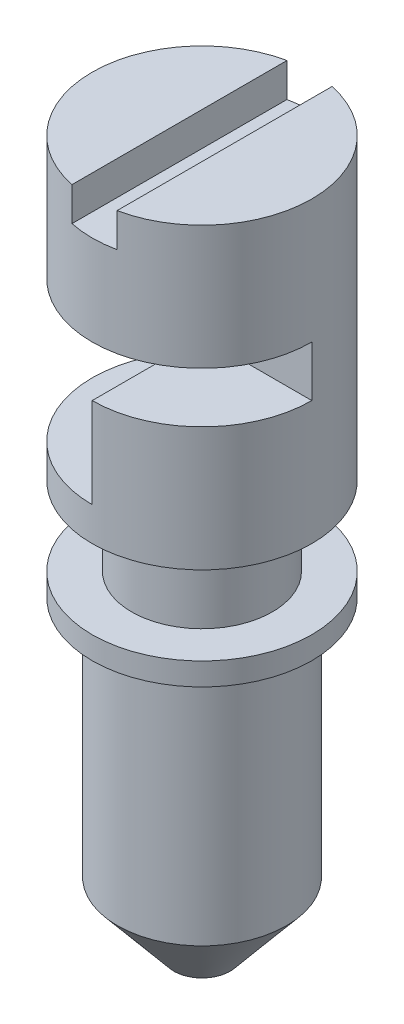
ISO-10303-21;
HEADER;
FILE_DESCRIPTION(('STEP AP214'),'2;1');
FILE_NAME('part.step','',(''),(''),'','','');
FILE_SCHEMA(('AUTOMOTIVE_DESIGN { 1 0 10303 214 1 1 1 1 }'));
ENDSEC;
DATA;
#1=APPLICATION_CONTEXT('core data for automotive mechanical design processes');
#2=APPLICATION_PROTOCOL_DEFINITION('international standard','automotive_design',2000,#1);
#3=PRODUCT_CONTEXT('',#1,'mechanical');
#4=PRODUCT('Part','Part','',(#3));
#5=PRODUCT_RELATED_PRODUCT_CATEGORY('part','',(#4));
#6=PRODUCT_DEFINITION_FORMATION('','',#4);
#7=PRODUCT_DEFINITION_CONTEXT('part definition',#1,'design');
#8=PRODUCT_DEFINITION('design','',#6,#7);
#9=PRODUCT_DEFINITION_SHAPE('','',#8);
#10=(LENGTH_UNIT() NAMED_UNIT(*) SI_UNIT(.MILLI.,.METRE.));
#11=(NAMED_UNIT(*) PLANE_ANGLE_UNIT() SI_UNIT($,.RADIAN.));
#12=(NAMED_UNIT(*) SI_UNIT($,.STERADIAN.) SOLID_ANGLE_UNIT());
#13=UNCERTAINTY_MEASURE_WITH_UNIT(LENGTH_MEASURE(1.E-05),#10,'distance_accuracy_value','');
#14=(GEOMETRIC_REPRESENTATION_CONTEXT(3) GLOBAL_UNCERTAINTY_ASSIGNED_CONTEXT((#13)) GLOBAL_UNIT_ASSIGNED_CONTEXT((#10,
#11,#12)) REPRESENTATION_CONTEXT('',''));
#15=CARTESIAN_POINT('',(0.,0.,0.));
#16=DIRECTION('',(0.,0.,1.));
#17=DIRECTION('',(1.,0.,0.));
#18=AXIS2_PLACEMENT_3D('',#15,#16,#17);
#19=CARTESIAN_POINT('',(0.,5.3,0.));
#20=DIRECTION('',(0.,1.,0.));
#21=DIRECTION('',(0.,0.,1.));
#22=AXIS2_PLACEMENT_3D('',#19,#20,#21);
#23=PLANE('',#22);
#24=DIRECTION('',(0.,0.,-1.));
#25=VECTOR('',#24,1.);
#26=CARTESIAN_POINT('',(0.4,5.3,0.));
#27=LINE('',#26,#25);
#28=CARTESIAN_POINT('',(0.4,5.3,1.90853346839923));
#29=VERTEX_POINT('',#28);
#30=CARTESIAN_POINT('',(0.4,5.3,-1.90853346839923));
#31=VERTEX_POINT('',#30);
#32=EDGE_CURVE('E163',#29,#31,#27,.T.);
#33=ORIENTED_EDGE('',*,*,#32,.F.);
#34=CARTESIAN_POINT('',(0.,5.3,0.));
#35=DIRECTION('',(0.,1.,0.));
#36=DIRECTION('',(0.,0.,1.));
#37=AXIS2_PLACEMENT_3D('',#34,#35,#36);
#38=CIRCLE('',#37,1.95);
#39=EDGE_CURVE('E158',#29,#31,#38,.T.);
#40=ORIENTED_EDGE('',*,*,#39,.T.);
#41=EDGE_LOOP('',(#33,#40));
#42=FACE_BOUND('',#41,.T.);
#43=ADVANCED_FACE('F38',(#42),#23,.T.);
#44=CARTESIAN_POINT('',(0.,5.3,0.));
#45=DIRECTION('',(0.,-1.,0.));
#46=DIRECTION('',(0.,0.,-1.));
#47=AXIS2_PLACEMENT_3D('',#44,#45,#46);
#48=CYLINDRICAL_SURFACE('',#47,1.95);
#49=CARTESIAN_POINT('',(0.,3.1,0.));
#50=DIRECTION('',(0.,1.,0.));
#51=DIRECTION('',(0.,0.,1.));
#52=AXIS2_PLACEMENT_3D('',#49,#50,#51);
#53=CIRCLE('',#52,1.95);
#54=CARTESIAN_POINT('',(0.,3.1,-1.95));
#55=VERTEX_POINT('',#54);
#56=CARTESIAN_POINT('',(1.95,3.1,0.));
#57=VERTEX_POINT('',#56);
#58=EDGE_CURVE('E119',#55,#57,#53,.T.);
#59=ORIENTED_EDGE('',*,*,#58,.T.);
#60=DIRECTION('',(0.,1.,0.));
#61=VECTOR('',#60,1.);
#62=CARTESIAN_POINT('',(1.95,2.2,0.));
#63=LINE('',#62,#61);
#64=CARTESIAN_POINT('',(1.95,2.2,0.));
#65=VERTEX_POINT('',#64);
#66=EDGE_CURVE('E115',#65,#57,#63,.T.);
#67=ORIENTED_EDGE('',*,*,#66,.F.);
#68=CARTESIAN_POINT('',(0.,2.2,0.));
#69=DIRECTION('',(0.,-1.,0.));
#70=DIRECTION('',(0.,0.,-1.));
#71=AXIS2_PLACEMENT_3D('',#68,#69,#70);
#72=CIRCLE('',#71,1.95);
#73=CARTESIAN_POINT('',(0.,2.2,1.95));
#74=VERTEX_POINT('',#73);
#75=EDGE_CURVE('E103',#65,#74,#72,.T.);
#76=ORIENTED_EDGE('',*,*,#75,.T.);
#77=DIRECTION('',(0.,1.,0.));
#78=VECTOR('',#77,1.);
#79=CARTESIAN_POINT('',(0.,0.6,1.95));
#80=LINE('',#79,#78);
#81=CARTESIAN_POINT('',(0.,0.6,1.95));
#82=VERTEX_POINT('',#81);
#83=EDGE_CURVE('E109',#82,#74,#80,.T.);
#84=ORIENTED_EDGE('',*,*,#83,.F.);
#85=CARTESIAN_POINT('',(0.,0.600000000000001,0.));
#86=DIRECTION('',(0.,-1.,0.));
#87=DIRECTION('',(1.,0.,0.));
#88=AXIS2_PLACEMENT_3D('',#85,#86,#87);
#89=CIRCLE('',#88,1.95);
#90=CARTESIAN_POINT('',(0.,0.6,-1.95));
#91=VERTEX_POINT('',#90);
#92=EDGE_CURVE('E168',#82,#91,#89,.T.);
#93=ORIENTED_EDGE('',*,*,#92,.T.);
#94=DIRECTION('',(0.,1.,0.));
#95=VECTOR('',#94,1.);
#96=CARTESIAN_POINT('',(0.,0.6,-1.95));
#97=LINE('',#96,#95);
#98=EDGE_CURVE('E130',#91,#55,#97,.T.);
#99=ORIENTED_EDGE('',*,*,#98,.T.);
#100=EDGE_LOOP('',(#59,#67,#76,#84,#93,#99));
#101=FACE_BOUND('',#100,.T.);
#102=CARTESIAN_POINT('',(0.,4.7,0.));
#103=DIRECTION('',(0.,1.,0.));
#104=DIRECTION('',(0.,0.,1.));
#105=AXIS2_PLACEMENT_3D('',#102,#103,#104);
#106=CIRCLE('',#105,1.95);
#107=CARTESIAN_POINT('',(0.4,4.7,-1.90853346839923));
#108=VERTEX_POINT('',#107);
#109=CARTESIAN_POINT('',(-0.4,4.7,-1.90853346839923));
#110=VERTEX_POINT('',#109);
#111=EDGE_CURVE('E167',#108,#110,#106,.T.);
#112=ORIENTED_EDGE('',*,*,#111,.F.);
#113=DIRECTION('',(0.,-1.,0.));
#114=VECTOR('',#113,1.);
#115=CARTESIAN_POINT('',(0.4,5.3,-1.90853346839923));
#116=LINE('',#115,#114);
#117=EDGE_CURVE('E148',#108,#31,#116,.F.);
#118=ORIENTED_EDGE('',*,*,#117,.T.);
#119=ORIENTED_EDGE('',*,*,#39,.F.);
#120=DIRECTION('',(0.,-1.,0.));
#121=VECTOR('',#120,1.);
#122=CARTESIAN_POINT('',(0.4,5.3,1.90853346839923));
#123=LINE('',#122,#121);
#124=CARTESIAN_POINT('',(0.4,4.7,1.90853346839923));
#125=VERTEX_POINT('',#124);
#126=EDGE_CURVE('E151',#29,#125,#123,.T.);
#127=ORIENTED_EDGE('',*,*,#126,.T.);
#128=CARTESIAN_POINT('',(-0.4,4.7,1.90853346839923));
#129=VERTEX_POINT('',#128);
#130=EDGE_CURVE('E165',#129,#125,#106,.T.);
#131=ORIENTED_EDGE('',*,*,#130,.F.);
#132=DIRECTION('',(0.,-1.,0.));
#133=VECTOR('',#132,1.);
#134=CARTESIAN_POINT('',(-0.4,5.3,1.90853346839923));
#135=LINE('',#134,#133);
#136=CARTESIAN_POINT('',(-0.4,5.3,1.90853346839923));
#137=VERTEX_POINT('',#136);
#138=EDGE_CURVE('E142',#129,#137,#135,.F.);
#139=ORIENTED_EDGE('',*,*,#138,.T.);
#140=CARTESIAN_POINT('',(-0.4,5.3,-1.90853346839923));
#141=VERTEX_POINT('',#140);
#142=EDGE_CURVE('E155',#141,#137,#38,.T.);
#143=ORIENTED_EDGE('',*,*,#142,.F.);
#144=DIRECTION('',(0.,-1.,0.));
#145=VECTOR('',#144,1.);
#146=CARTESIAN_POINT('',(-0.4,5.3,-1.90853346839923));
#147=LINE('',#146,#145);
#148=EDGE_CURVE('E145',#141,#110,#147,.T.);
#149=ORIENTED_EDGE('',*,*,#148,.T.);
#150=EDGE_LOOP('',(#112,#118,#119,#127,#131,#139,#143,#149));
#151=FACE_BOUND('',#150,.T.);
#152=CARTESIAN_POINT('',(0.,0.,0.));
#153=DIRECTION('',(0.,1.,0.));
#154=DIRECTION('',(0.,0.,1.));
#155=AXIS2_PLACEMENT_3D('',#152,#153,#154);
#156=CIRCLE('',#155,1.95);
#157=CARTESIAN_POINT('',(0.,0.,1.95));
#158=VERTEX_POINT('',#157);
#159=EDGE_CURVE('E154',#158,#158,#156,.T.);
#160=ORIENTED_EDGE('',*,*,#159,.T.);
#161=EDGE_LOOP('',(#160));
#162=FACE_BOUND('',#161,.T.);
#163=ADVANCED_FACE('F40',(#101,#151,#162),#48,.T.);
#164=DIRECTION('',(0.,0.,1.));
#165=VECTOR('',#164,1.);
#166=CARTESIAN_POINT('',(-0.4,5.3,0.));
#167=LINE('',#166,#165);
#168=EDGE_CURVE('E161',#141,#137,#167,.T.);
#169=ORIENTED_EDGE('',*,*,#168,.F.);
#170=ORIENTED_EDGE('',*,*,#142,.T.);
#171=EDGE_LOOP('',(#169,#170));
#172=FACE_BOUND('',#171,.T.);
#173=ADVANCED_FACE('F192',(#172),#23,.T.);
#174=CARTESIAN_POINT('',(0.,0.,0.));
#175=DIRECTION('',(0.,1.,0.));
#176=DIRECTION('',(0.,0.,1.));
#177=AXIS2_PLACEMENT_3D('',#174,#175,#176);
#178=PLANE('',#177);
#179=CARTESIAN_POINT('',(0.,0.,0.));
#180=DIRECTION('',(0.,1.,0.));
#181=DIRECTION('',(-1.,0.,0.));
#182=AXIS2_PLACEMENT_3D('',#179,#180,#181);
#183=CIRCLE('',#182,1.25);
#184=CARTESIAN_POINT('',(-1.25,0.,0.));
#185=VERTEX_POINT('',#184);
#186=EDGE_CURVE('E121',#185,#185,#183,.T.);
#187=ORIENTED_EDGE('',*,*,#186,.T.);
#188=EDGE_LOOP('',(#187));
#189=FACE_BOUND('',#188,.T.);
#190=ORIENTED_EDGE('',*,*,#159,.F.);
#191=EDGE_LOOP('',(#190));
#192=FACE_BOUND('',#191,.T.);
#193=ADVANCED_FACE('F199',(#189,#192),#178,.F.);
#194=CARTESIAN_POINT('',(0.,4.7,0.));
#195=DIRECTION('',(0.,1.,0.));
#196=DIRECTION('',(0.,0.,1.));
#197=AXIS2_PLACEMENT_3D('',#194,#195,#196);
#198=PLANE('',#197);
#199=DIRECTION('',(0.,0.,-1.));
#200=VECTOR('',#199,1.);
#201=CARTESIAN_POINT('',(0.4,4.7,-1.95));
#202=LINE('',#201,#200);
#203=EDGE_CURVE('E135',#125,#108,#202,.T.);
#204=ORIENTED_EDGE('',*,*,#203,.T.);
#205=ORIENTED_EDGE('',*,*,#111,.T.);
#206=DIRECTION('',(0.,0.,1.));
#207=VECTOR('',#206,1.);
#208=CARTESIAN_POINT('',(-0.4,4.7,-1.95));
#209=LINE('',#208,#207);
#210=EDGE_CURVE('E139',#110,#129,#209,.T.);
#211=ORIENTED_EDGE('',*,*,#210,.T.);
#212=ORIENTED_EDGE('',*,*,#130,.T.);
#213=EDGE_LOOP('',(#204,#205,#211,#212));
#214=FACE_BOUND('',#213,.T.);
#215=ADVANCED_FACE('F204',(#214),#198,.T.);
#216=CARTESIAN_POINT('',(0.4,4.7,-1.95));
#217=DIRECTION('',(1.,0.,0.));
#218=DIRECTION('',(0.,0.,-1.));
#219=AXIS2_PLACEMENT_3D('',#216,#217,#218);
#220=PLANE('',#219);
#221=ORIENTED_EDGE('',*,*,#32,.T.);
#222=ORIENTED_EDGE('',*,*,#117,.F.);
#223=ORIENTED_EDGE('',*,*,#203,.F.);
#224=ORIENTED_EDGE('',*,*,#126,.F.);
#225=EDGE_LOOP('',(#221,#222,#223,#224));
#226=FACE_BOUND('',#225,.T.);
#227=ADVANCED_FACE('F184',(#226),#220,.F.);
#228=CARTESIAN_POINT('',(-0.4,4.7,-1.95));
#229=DIRECTION('',(-1.,0.,0.));
#230=DIRECTION('',(0.,0.,1.));
#231=AXIS2_PLACEMENT_3D('',#228,#229,#230);
#232=PLANE('',#231);
#233=ORIENTED_EDGE('',*,*,#168,.T.);
#234=ORIENTED_EDGE('',*,*,#138,.F.);
#235=ORIENTED_EDGE('',*,*,#210,.F.);
#236=ORIENTED_EDGE('',*,*,#148,.F.);
#237=EDGE_LOOP('',(#233,#234,#235,#236));
#238=FACE_BOUND('',#237,.T.);
#239=ADVANCED_FACE('F177',(#238),#232,.F.);
#240=CARTESIAN_POINT('',(0.,3.1,-1.95));
#241=DIRECTION('',(0.,1.,0.));
#242=DIRECTION('',(0.,0.,1.));
#243=AXIS2_PLACEMENT_3D('',#240,#241,#242);
#244=PLANE('',#243);
#245=DIRECTION('',(0.,0.,1.));
#246=VECTOR('',#245,1.);
#247=CARTESIAN_POINT('',(0.,3.1,-1.95));
#248=LINE('',#247,#246);
#249=CARTESIAN_POINT('',(0.,3.1,0.));
#250=VERTEX_POINT('',#249);
#251=EDGE_CURVE('E132',#55,#250,#248,.T.);
#252=ORIENTED_EDGE('',*,*,#251,.T.);
#253=DIRECTION('',(1.,0.,0.));
#254=VECTOR('',#253,1.);
#255=CARTESIAN_POINT('',(-1.95,3.1,0.));
#256=LINE('',#255,#254);
#257=EDGE_CURVE('E110',#250,#57,#256,.T.);
#258=ORIENTED_EDGE('',*,*,#257,.T.);
#259=ORIENTED_EDGE('',*,*,#58,.F.);
#260=EDGE_LOOP('',(#252,#258,#259));
#261=FACE_BOUND('',#260,.T.);
#262=ADVANCED_FACE('F175',(#261),#244,.F.);
#263=CARTESIAN_POINT('',(0.,0.6,-1.95));
#264=DIRECTION('',(0.,-1.,0.));
#265=DIRECTION('',(1.,0.,0.));
#266=AXIS2_PLACEMENT_3D('',#263,#264,#265);
#267=PLANE('',#266);
#268=DIRECTION('',(0.,0.,1.));
#269=VECTOR('',#268,1.);
#270=CARTESIAN_POINT('',(0.,0.6,-1.95));
#271=LINE('',#270,#269);
#272=EDGE_CURVE('E61',#91,#82,#271,.T.);
#273=ORIENTED_EDGE('',*,*,#272,.F.);
#274=ORIENTED_EDGE('',*,*,#92,.F.);
#275=EDGE_LOOP('',(#273,#274));
#276=FACE_BOUND('',#275,.T.);
#277=ADVANCED_FACE('F173',(#276),#267,.F.);
#278=CARTESIAN_POINT('',(0.,0.6,-1.95));
#279=DIRECTION('',(1.,0.,0.));
#280=DIRECTION('',(0.,0.,-1.));
#281=AXIS2_PLACEMENT_3D('',#278,#279,#280);
#282=PLANE('',#281);
#283=DIRECTION('',(0.,0.,-1.));
#284=VECTOR('',#283,1.);
#285=CARTESIAN_POINT('',(0.,2.2,-1.95));
#286=LINE('',#285,#284);
#287=CARTESIAN_POINT('',(0.,2.2,0.));
#288=VERTEX_POINT('',#287);
#289=EDGE_CURVE('E46',#74,#288,#286,.T.);
#290=ORIENTED_EDGE('',*,*,#289,.T.);
#291=DIRECTION('',(0.,1.,0.));
#292=VECTOR('',#291,1.);
#293=CARTESIAN_POINT('',(0.,0.6,0.));
#294=LINE('',#293,#292);
#295=EDGE_CURVE('E12',#288,#250,#294,.T.);
#296=ORIENTED_EDGE('',*,*,#295,.T.);
#297=ORIENTED_EDGE('',*,*,#251,.F.);
#298=ORIENTED_EDGE('',*,*,#98,.F.);
#299=ORIENTED_EDGE('',*,*,#272,.T.);
#300=ORIENTED_EDGE('',*,*,#83,.T.);
#301=EDGE_LOOP('',(#290,#296,#297,#298,#299,#300));
#302=FACE_BOUND('',#301,.T.);
#303=ADVANCED_FACE('F170',(#302),#282,.F.);
#304=CARTESIAN_POINT('',(-1.95,2.2,0.));
#305=DIRECTION('',(0.,0.,-1.));
#306=DIRECTION('',(-1.,0.,0.));
#307=AXIS2_PLACEMENT_3D('',#304,#305,#306);
#308=PLANE('',#307);
#309=DIRECTION('',(1.,0.,0.));
#310=VECTOR('',#309,1.);
#311=CARTESIAN_POINT('',(-1.95,2.2,0.));
#312=LINE('',#311,#310);
#313=EDGE_CURVE('E53',#288,#65,#312,.T.);
#314=ORIENTED_EDGE('',*,*,#313,.T.);
#315=ORIENTED_EDGE('',*,*,#66,.T.);
#316=ORIENTED_EDGE('',*,*,#257,.F.);
#317=ORIENTED_EDGE('',*,*,#295,.F.);
#318=EDGE_LOOP('',(#314,#315,#316,#317));
#319=FACE_BOUND('',#318,.T.);
#320=ADVANCED_FACE('F114',(#319),#308,.F.);
#321=CARTESIAN_POINT('',(-1.95,2.2,0.));
#322=DIRECTION('',(0.,-1.,0.));
#323=DIRECTION('',(0.,0.,-1.));
#324=AXIS2_PLACEMENT_3D('',#321,#322,#323);
#325=PLANE('',#324);
#326=ORIENTED_EDGE('',*,*,#313,.F.);
#327=ORIENTED_EDGE('',*,*,#289,.F.);
#328=ORIENTED_EDGE('',*,*,#75,.F.);
#329=EDGE_LOOP('',(#326,#327,#328));
#330=FACE_BOUND('',#329,.T.);
#331=ADVANCED_FACE('F104',(#330),#325,.F.);
#332=CARTESIAN_POINT('',(0.,0.,0.));
#333=DIRECTION('',(0.,1.,0.));
#334=DIRECTION('',(-1.,0.,0.));
#335=AXIS2_PLACEMENT_3D('',#332,#333,#334);
#336=CYLINDRICAL_SURFACE('',#335,1.25);
#337=CARTESIAN_POINT('',(0.,-1.4,0.));
#338=DIRECTION('',(0.,1.,0.));
#339=DIRECTION('',(-1.,0.,0.));
#340=AXIS2_PLACEMENT_3D('',#337,#338,#339);
#341=CIRCLE('',#340,1.25);
#342=CARTESIAN_POINT('',(-1.25,-1.4,0.));
#343=VERTEX_POINT('',#342);
#344=EDGE_CURVE('E266',#343,#343,#341,.T.);
#345=ORIENTED_EDGE('',*,*,#344,.T.);
#346=EDGE_LOOP('',(#345));
#347=FACE_BOUND('',#346,.T.);
#348=ORIENTED_EDGE('',*,*,#186,.F.);
#349=EDGE_LOOP('',(#348));
#350=FACE_BOUND('',#349,.T.);
#351=ADVANCED_FACE('F230',(#347,#350),#336,.T.);
#352=CARTESIAN_POINT('',(-0.499999999999999,-7.3,0.));
#353=DIRECTION('',(0.,-1.,0.));
#354=DIRECTION('',(1.,0.,0.));
#355=AXIS2_PLACEMENT_3D('',#352,#353,#354);
#356=PLANE('',#355);
#357=CARTESIAN_POINT('',(0.,-7.3,0.));
#358=DIRECTION('',(0.,1.,0.));
#359=DIRECTION('',(-1.,0.,0.));
#360=AXIS2_PLACEMENT_3D('',#357,#358,#359);
#361=CIRCLE('',#360,0.5);
#362=CARTESIAN_POINT('',(-0.499999999999999,-7.3,0.));
#363=VERTEX_POINT('',#362);
#364=EDGE_CURVE('E124',#363,#363,#361,.T.);
#365=ORIENTED_EDGE('',*,*,#364,.F.);
#366=EDGE_LOOP('',(#365));
#367=FACE_BOUND('',#366,.T.);
#368=ADVANCED_FACE('F234',(#367),#356,.T.);
#369=CARTESIAN_POINT('',(0.,-6.1,0.));
#370=DIRECTION('',(0.,1.,0.));
#371=DIRECTION('',(-1.,0.,0.));
#372=AXIS2_PLACEMENT_3D('',#369,#370,#371);
#373=CONICAL_SURFACE('',#372,1.5,0.694738276196703);
#374=CARTESIAN_POINT('',(0.,-6.1,0.));
#375=DIRECTION('',(0.,1.,0.));
#376=DIRECTION('',(-1.,0.,0.));
#377=AXIS2_PLACEMENT_3D('',#374,#375,#376);
#378=CIRCLE('',#377,1.5);
#379=CARTESIAN_POINT('',(-1.5,-6.1,0.));
#380=VERTEX_POINT('',#379);
#381=EDGE_CURVE('E279',#380,#380,#378,.T.);
#382=CARTESIAN_POINT('',(-0.499999999999999,-7.3,0.));
#383=CARTESIAN_POINT('',(-0.510416666666665,-7.2875,0.));
#384=CARTESIAN_POINT('',(-0.520833333333332,-7.275,0.));
#385=CARTESIAN_POINT('',(-0.541666666666665,-7.25,0.));
#386=CARTESIAN_POINT('',(-0.552083333333332,-7.2375,0.));
#387=CARTESIAN_POINT('',(-0.572916666666665,-7.2125,0.));
#388=CARTESIAN_POINT('',(-0.583333333333332,-7.2,0.));
#389=CARTESIAN_POINT('',(-0.604166666666665,-7.175,0.));
#390=CARTESIAN_POINT('',(-0.614583333333332,-7.1625,0.));
#391=CARTESIAN_POINT('',(-0.635416666666665,-7.1375,0.));
#392=CARTESIAN_POINT('',(-0.645833333333332,-7.125,0.));
#393=CARTESIAN_POINT('',(-0.666666666666665,-7.1,0.));
#394=CARTESIAN_POINT('',(-0.677083333333332,-7.0875,0.));
#395=CARTESIAN_POINT('',(-0.697916666666665,-7.0625,0.));
#396=CARTESIAN_POINT('',(-0.708333333333332,-7.05,0.));
#397=CARTESIAN_POINT('',(-0.729166666666665,-7.025,0.));
#398=CARTESIAN_POINT('',(-0.739583333333332,-7.0125,0.));
#399=CARTESIAN_POINT('',(-0.760416666666665,-6.9875,0.));
#400=CARTESIAN_POINT('',(-0.770833333333332,-6.975,0.));
#401=CARTESIAN_POINT('',(-0.791666666666665,-6.95,0.));
#402=CARTESIAN_POINT('',(-0.802083333333332,-6.9375,0.));
#403=CARTESIAN_POINT('',(-0.822916666666665,-6.9125,0.));
#404=CARTESIAN_POINT('',(-0.833333333333332,-6.9,0.));
#405=CARTESIAN_POINT('',(-0.854166666666665,-6.875,0.));
#406=CARTESIAN_POINT('',(-0.864583333333332,-6.8625,0.));
#407=CARTESIAN_POINT('',(-0.885416666666666,-6.8375,0.));
#408=CARTESIAN_POINT('',(-0.895833333333332,-6.825,0.));
#409=CARTESIAN_POINT('',(-0.916666666666665,-6.8,0.));
#410=CARTESIAN_POINT('',(-0.927083333333332,-6.7875,0.));
#411=CARTESIAN_POINT('',(-0.947916666666665,-6.7625,0.));
#412=CARTESIAN_POINT('',(-0.958333333333332,-6.75,0.));
#413=CARTESIAN_POINT('',(-0.979166666666665,-6.725,0.));
#414=CARTESIAN_POINT('',(-0.989583333333332,-6.7125,0.));
#415=CARTESIAN_POINT('',(-1.01041666666667,-6.6875,0.));
#416=CARTESIAN_POINT('',(-1.02083333333333,-6.675,0.));
#417=CARTESIAN_POINT('',(-1.04166666666667,-6.65,0.));
#418=CARTESIAN_POINT('',(-1.05208333333333,-6.6375,0.));
#419=CARTESIAN_POINT('',(-1.07291666666667,-6.6125,0.));
#420=CARTESIAN_POINT('',(-1.08333333333333,-6.6,0.));
#421=CARTESIAN_POINT('',(-1.10416666666667,-6.575,0.));
#422=CARTESIAN_POINT('',(-1.11458333333333,-6.5625,0.));
#423=CARTESIAN_POINT('',(-1.13541666666667,-6.5375,0.));
#424=CARTESIAN_POINT('',(-1.14583333333333,-6.525,0.));
#425=CARTESIAN_POINT('',(-1.16666666666667,-6.5,0.));
#426=CARTESIAN_POINT('',(-1.17708333333333,-6.4875,0.));
#427=CARTESIAN_POINT('',(-1.19791666666667,-6.4625,0.));
#428=CARTESIAN_POINT('',(-1.20833333333333,-6.45,0.));
#429=CARTESIAN_POINT('',(-1.22916666666667,-6.425,0.));
#430=CARTESIAN_POINT('',(-1.23958333333333,-6.4125,0.));
#431=CARTESIAN_POINT('',(-1.26041666666667,-6.3875,0.));
#432=CARTESIAN_POINT('',(-1.27083333333333,-6.375,0.));
#433=CARTESIAN_POINT('',(-1.29166666666667,-6.35,0.));
#434=CARTESIAN_POINT('',(-1.30208333333333,-6.3375,0.));
#435=CARTESIAN_POINT('',(-1.32291666666667,-6.3125,0.));
#436=CARTESIAN_POINT('',(-1.33333333333333,-6.3,0.));
#437=CARTESIAN_POINT('',(-1.35416666666667,-6.275,0.));
#438=CARTESIAN_POINT('',(-1.36458333333333,-6.2625,0.));
#439=CARTESIAN_POINT('',(-1.38541666666667,-6.2375,0.));
#440=CARTESIAN_POINT('',(-1.39583333333333,-6.225,0.));
#441=CARTESIAN_POINT('',(-1.41666666666667,-6.2,0.));
#442=CARTESIAN_POINT('',(-1.42708333333333,-6.1875,0.));
#443=CARTESIAN_POINT('',(-1.44791666666667,-6.1625,0.));
#444=CARTESIAN_POINT('',(-1.45833333333333,-6.15,0.));
#445=CARTESIAN_POINT('',(-1.47916666666667,-6.125,0.));
#446=CARTESIAN_POINT('',(-1.48958333333333,-6.1125,0.));
#447=CARTESIAN_POINT('',(-1.5,-6.1,0.));
#448=B_SPLINE_CURVE_WITH_KNOTS('',3,(#382,#383,#384,#385,#386,#387,#388,#389,#390,#391,#392,
#393,#394,#395,#396,#397,#398,#399,#400,#401,#402,#403,#404,#405,#406,#407,#408,#409,#410,#411,
#412,#413,#414,#415,#416,#417,#418,#419,#420,#421,#422,#423,#424,#425,#426,#427,#428,#429,#430,
#431,#432,#433,#434,#435,#436,#437,#438,#439,#440,#441,#442,#443,#444,#445,#446,#447),
.UNSPECIFIED.,.F.,.F.,(4,2,2,2,2,2,2,2,2,2,2,2,2,2,2,2,2,2,2,2,2,2,2,2,2,2,2,2,2,2,2,2,4),(0.,
0.048814060474416,0.0976281209488328,0.14644218142325,0.195256241897666,0.244070302372082,
0.292884362846499,0.341698423320916,0.390512483795333,0.439326544269749,0.488140604744165,
0.536954665218582,0.585768725692998,0.634582786167415,0.683396846641832,0.732210907116249,
0.781024967590666,0.829839028065082,0.878653088539498,0.927467149013915,0.976281209488331,
1.02509526996275,1.07390933043716,1.12272339091158,1.171537451386,1.22035151186041,
1.26916557233483,1.31797963280925,1.36679369328366,1.41560775375808,1.4644218142325,
1.51323587470691,1.56204993518133),.UNSPECIFIED.);
#449=EDGE_CURVE('BSEAM238',#363,#380,#448,.T.);
#450=ORIENTED_EDGE('',*,*,#364,.T.);
#451=ORIENTED_EDGE('',*,*,#381,.F.);
#452=ORIENTED_EDGE('',*,*,#449,.T.);
#453=ORIENTED_EDGE('',*,*,#449,.F.);
#454=EDGE_LOOP('',(#450,#452,#451,#453));
#455=FACE_BOUND('',#454,.T.);
#456=ADVANCED_FACE('F238',(#455),#373,.T.);
#457=CARTESIAN_POINT('',(0.,0.,0.));
#458=DIRECTION('',(0.,1.,0.));
#459=DIRECTION('',(-1.,0.,0.));
#460=AXIS2_PLACEMENT_3D('',#457,#458,#459);
#461=CYLINDRICAL_SURFACE('',#460,1.5);
#462=ORIENTED_EDGE('',*,*,#381,.T.);
#463=EDGE_LOOP('',(#462));
#464=FACE_BOUND('',#463,.T.);
#465=CARTESIAN_POINT('',(0.,-1.8,0.));
#466=DIRECTION('',(0.,1.,0.));
#467=DIRECTION('',(-1.,0.,0.));
#468=AXIS2_PLACEMENT_3D('',#465,#466,#467);
#469=CIRCLE('',#468,1.5);
#470=CARTESIAN_POINT('',(-1.5,-1.8,0.));
#471=VERTEX_POINT('',#470);
#472=EDGE_CURVE('E275',#471,#471,#469,.T.);
#473=ORIENTED_EDGE('',*,*,#472,.F.);
#474=EDGE_LOOP('',(#473));
#475=FACE_BOUND('',#474,.T.);
#476=ADVANCED_FACE('F242',(#464,#475),#461,.T.);
#477=CARTESIAN_POINT('',(-1.95,-1.8,0.));
#478=DIRECTION('',(0.,-1.,0.));
#479=DIRECTION('',(1.,0.,0.));
#480=AXIS2_PLACEMENT_3D('',#477,#478,#479);
#481=PLANE('',#480);
#482=ORIENTED_EDGE('',*,*,#472,.T.);
#483=EDGE_LOOP('',(#482));
#484=FACE_BOUND('',#483,.T.);
#485=CARTESIAN_POINT('',(0.,-1.8,0.));
#486=DIRECTION('',(0.,1.,0.));
#487=DIRECTION('',(-1.,0.,0.));
#488=AXIS2_PLACEMENT_3D('',#485,#486,#487);
#489=CIRCLE('',#488,1.95);
#490=CARTESIAN_POINT('',(-1.95,-1.8,0.));
#491=VERTEX_POINT('',#490);
#492=EDGE_CURVE('E269',#491,#491,#489,.T.);
#493=ORIENTED_EDGE('',*,*,#492,.F.);
#494=EDGE_LOOP('',(#493));
#495=FACE_BOUND('',#494,.T.);
#496=ADVANCED_FACE('F246',(#484,#495),#481,.T.);
#497=CARTESIAN_POINT('',(0.,0.,0.));
#498=DIRECTION('',(0.,1.,0.));
#499=DIRECTION('',(-1.,0.,0.));
#500=AXIS2_PLACEMENT_3D('',#497,#498,#499);
#501=CYLINDRICAL_SURFACE('',#500,1.95);
#502=ORIENTED_EDGE('',*,*,#492,.T.);
#503=EDGE_LOOP('',(#502));
#504=FACE_BOUND('',#503,.T.);
#505=CARTESIAN_POINT('',(0.,-1.4,0.));
#506=DIRECTION('',(0.,1.,0.));
#507=DIRECTION('',(-1.,0.,0.));
#508=AXIS2_PLACEMENT_3D('',#505,#506,#507);
#509=CIRCLE('',#508,1.95);
#510=CARTESIAN_POINT('',(-1.95,-1.4,0.));
#511=VERTEX_POINT('',#510);
#512=EDGE_CURVE('E263',#511,#511,#509,.T.);
#513=ORIENTED_EDGE('',*,*,#512,.F.);
#514=EDGE_LOOP('',(#513));
#515=FACE_BOUND('',#514,.T.);
#516=ADVANCED_FACE('F250',(#504,#515),#501,.T.);
#517=CARTESIAN_POINT('',(-1.25,-1.4,0.));
#518=DIRECTION('',(0.,1.,0.));
#519=DIRECTION('',(-1.,0.,0.));
#520=AXIS2_PLACEMENT_3D('',#517,#518,#519);
#521=PLANE('',#520);
#522=ORIENTED_EDGE('',*,*,#512,.T.);
#523=EDGE_LOOP('',(#522));
#524=FACE_BOUND('',#523,.T.);
#525=ORIENTED_EDGE('',*,*,#344,.F.);
#526=EDGE_LOOP('',(#525));
#527=FACE_BOUND('',#526,.T.);
#528=ADVANCED_FACE('F254',(#524,#527),#521,.T.);
#529=CLOSED_SHELL('',(#43,#163,#173,#193,#215,#227,#239,#262,#277,#303,#320,#331,#351,#368,#456,
#476,#496,#516,#528));
#530=MANIFOLD_SOLID_BREP('B2',#529);
#531=ADVANCED_BREP_SHAPE_REPRESENTATION('',(#18,#530),#14);
#532=SHAPE_DEFINITION_REPRESENTATION(#9,#531);
ENDSEC;
END-ISO-10303-21;
